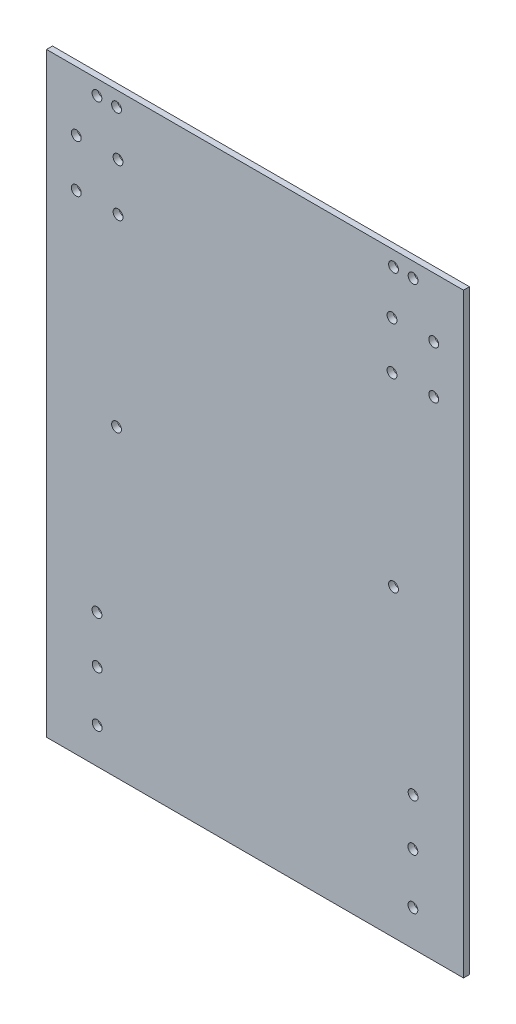
ISO-10303-21;
HEADER;
FILE_DESCRIPTION(('STEP AP214'),'2;1');
FILE_NAME('part.step','',(''),(''),'','','');
FILE_SCHEMA(('AUTOMOTIVE_DESIGN { 1 0 10303 214 1 1 1 1 }'));
ENDSEC;
DATA;
#1=APPLICATION_CONTEXT('core data for automotive mechanical design processes');
#2=APPLICATION_PROTOCOL_DEFINITION('international standard','automotive_design',2000,#1);
#3=PRODUCT_CONTEXT('',#1,'mechanical');
#4=PRODUCT('Part','Part','',(#3));
#5=PRODUCT_RELATED_PRODUCT_CATEGORY('part','',(#4));
#6=PRODUCT_DEFINITION_FORMATION('','',#4);
#7=PRODUCT_DEFINITION_CONTEXT('part definition',#1,'design');
#8=PRODUCT_DEFINITION('design','',#6,#7);
#9=PRODUCT_DEFINITION_SHAPE('','',#8);
#10=(LENGTH_UNIT() NAMED_UNIT(*) SI_UNIT(.MILLI.,.METRE.));
#11=(NAMED_UNIT(*) PLANE_ANGLE_UNIT() SI_UNIT($,.RADIAN.));
#12=(NAMED_UNIT(*) SI_UNIT($,.STERADIAN.) SOLID_ANGLE_UNIT());
#13=UNCERTAINTY_MEASURE_WITH_UNIT(LENGTH_MEASURE(1.E-05),#10,'distance_accuracy_value','');
#14=(GEOMETRIC_REPRESENTATION_CONTEXT(3) GLOBAL_UNCERTAINTY_ASSIGNED_CONTEXT((#13)) GLOBAL_UNIT_ASSIGNED_CONTEXT((#10,
#11,#12)) REPRESENTATION_CONTEXT('',''));
#15=CARTESIAN_POINT('',(0.,0.,0.));
#16=DIRECTION('',(0.,0.,1.));
#17=DIRECTION('',(1.,0.,0.));
#18=AXIS2_PLACEMENT_3D('',#15,#16,#17);
#19=CARTESIAN_POINT('',(-34.1846700507614,39.4891878172589,2.));
#20=DIRECTION('',(1.,0.,0.));
#21=DIRECTION('',(0.,1.,0.));
#22=AXIS2_PLACEMENT_3D('',#19,#20,#21);
#23=PLANE('',#22);
#24=DIRECTION('',(0.,-1.,0.));
#25=VECTOR('',#24,1.);
#26=CARTESIAN_POINT('',(-34.1846700507614,39.4891878172589,0.));
#27=LINE('',#26,#25);
#28=CARTESIAN_POINT('',(-34.1846700507614,39.4891878172589,0.));
#29=VERTEX_POINT('',#28);
#30=CARTESIAN_POINT('',(-34.1846700507614,-160.510812182741,0.));
#31=VERTEX_POINT('',#30);
#32=EDGE_CURVE('E102',#29,#31,#27,.T.);
#33=ORIENTED_EDGE('',*,*,#32,.T.);
#34=DIRECTION('',(0.,0.,-1.));
#35=VECTOR('',#34,1.);
#36=CARTESIAN_POINT('',(-34.1846700507614,-160.510812182741,2.));
#37=LINE('',#36,#35);
#38=CARTESIAN_POINT('',(-34.1846700507614,-160.510812182741,2.));
#39=VERTEX_POINT('',#38);
#40=EDGE_CURVE('E11',#39,#31,#37,.T.);
#41=ORIENTED_EDGE('',*,*,#40,.F.);
#42=DIRECTION('',(0.,-1.,0.));
#43=VECTOR('',#42,1.);
#44=CARTESIAN_POINT('',(-34.1846700507614,39.4891878172589,2.));
#45=LINE('',#44,#43);
#46=CARTESIAN_POINT('',(-34.1846700507614,39.4891878172589,2.));
#47=VERTEX_POINT('',#46);
#48=EDGE_CURVE('E89',#47,#39,#45,.T.);
#49=ORIENTED_EDGE('',*,*,#48,.F.);
#50=DIRECTION('',(0.,0.,-1.));
#51=VECTOR('',#50,1.);
#52=CARTESIAN_POINT('',(-34.1846700507614,39.4891878172589,2.));
#53=LINE('',#52,#51);
#54=EDGE_CURVE('E98',#47,#29,#53,.T.);
#55=ORIENTED_EDGE('',*,*,#54,.T.);
#56=EDGE_LOOP('',(#33,#41,#49,#55));
#57=FACE_BOUND('',#56,.T.);
#58=ADVANCED_FACE('F36',(#57),#23,.F.);
#59=CARTESIAN_POINT('',(-34.1846700507614,-160.510812182741,2.));
#60=DIRECTION('',(0.,1.,0.));
#61=DIRECTION('',(0.,0.,1.));
#62=AXIS2_PLACEMENT_3D('',#59,#60,#61);
#63=PLANE('',#62);
#64=DIRECTION('',(1.,0.,0.));
#65=VECTOR('',#64,1.);
#66=CARTESIAN_POINT('',(-34.1846700507614,-160.510812182741,0.));
#67=LINE('',#66,#65);
#68=CARTESIAN_POINT('',(105.815329949239,-160.510812182741,0.));
#69=VERTEX_POINT('',#68);
#70=EDGE_CURVE('E93',#31,#69,#67,.T.);
#71=ORIENTED_EDGE('',*,*,#70,.T.);
#72=DIRECTION('',(0.,0.,-1.));
#73=VECTOR('',#72,1.);
#74=CARTESIAN_POINT('',(105.815329949239,-160.510812182741,2.));
#75=LINE('',#74,#73);
#76=CARTESIAN_POINT('',(105.815329949239,-160.510812182741,2.));
#77=VERTEX_POINT('',#76);
#78=EDGE_CURVE('E45',#77,#69,#75,.T.);
#79=ORIENTED_EDGE('',*,*,#78,.F.);
#80=DIRECTION('',(1.,0.,0.));
#81=VECTOR('',#80,1.);
#82=CARTESIAN_POINT('',(-34.1846700507614,-160.510812182741,2.));
#83=LINE('',#82,#81);
#84=EDGE_CURVE('E84',#39,#77,#83,.T.);
#85=ORIENTED_EDGE('',*,*,#84,.F.);
#86=ORIENTED_EDGE('',*,*,#40,.T.);
#87=EDGE_LOOP('',(#71,#79,#85,#86));
#88=FACE_BOUND('',#87,.T.);
#89=ADVANCED_FACE('F92',(#88),#63,.F.);
#90=CARTESIAN_POINT('',(105.815329949239,39.4891878172589,2.));
#91=DIRECTION('',(-1.,0.,0.));
#92=DIRECTION('',(0.,-1.,0.));
#93=AXIS2_PLACEMENT_3D('',#90,#91,#92);
#94=PLANE('',#93);
#95=DIRECTION('',(0.,1.,0.));
#96=VECTOR('',#95,1.);
#97=CARTESIAN_POINT('',(105.815329949239,39.4891878172589,0.));
#98=LINE('',#97,#96);
#99=CARTESIAN_POINT('',(105.815329949239,39.4891878172589,0.));
#100=VERTEX_POINT('',#99);
#101=EDGE_CURVE('E71',#69,#100,#98,.T.);
#102=ORIENTED_EDGE('',*,*,#101,.T.);
#103=DIRECTION('',(0.,0.,-1.));
#104=VECTOR('',#103,1.);
#105=CARTESIAN_POINT('',(105.815329949239,39.4891878172589,2.));
#106=LINE('',#105,#104);
#107=CARTESIAN_POINT('',(105.815329949239,39.4891878172589,2.));
#108=VERTEX_POINT('',#107);
#109=EDGE_CURVE('E94',#108,#100,#106,.T.);
#110=ORIENTED_EDGE('',*,*,#109,.F.);
#111=DIRECTION('',(0.,1.,0.));
#112=VECTOR('',#111,1.);
#113=CARTESIAN_POINT('',(105.815329949239,39.4891878172589,2.));
#114=LINE('',#113,#112);
#115=EDGE_CURVE('E87',#77,#108,#114,.T.);
#116=ORIENTED_EDGE('',*,*,#115,.F.);
#117=ORIENTED_EDGE('',*,*,#78,.T.);
#118=EDGE_LOOP('',(#102,#110,#116,#117));
#119=FACE_BOUND('',#118,.T.);
#120=ADVANCED_FACE('F96',(#119),#94,.F.);
#121=CARTESIAN_POINT('',(-34.1846700507614,39.4891878172589,2.));
#122=DIRECTION('',(0.,-1.,0.));
#123=DIRECTION('',(0.,0.,-1.));
#124=AXIS2_PLACEMENT_3D('',#121,#122,#123);
#125=PLANE('',#124);
#126=DIRECTION('',(-1.,0.,0.));
#127=VECTOR('',#126,1.);
#128=CARTESIAN_POINT('',(-34.1846700507614,39.4891878172589,0.));
#129=LINE('',#128,#127);
#130=EDGE_CURVE('E77',#100,#29,#129,.T.);
#131=ORIENTED_EDGE('',*,*,#130,.T.);
#132=ORIENTED_EDGE('',*,*,#54,.F.);
#133=DIRECTION('',(-1.,0.,0.));
#134=VECTOR('',#133,1.);
#135=CARTESIAN_POINT('',(-34.1846700507614,39.4891878172589,2.));
#136=LINE('',#135,#134);
#137=EDGE_CURVE('E54',#108,#47,#136,.T.);
#138=ORIENTED_EDGE('',*,*,#137,.F.);
#139=ORIENTED_EDGE('',*,*,#109,.T.);
#140=EDGE_LOOP('',(#131,#132,#138,#139));
#141=FACE_BOUND('',#140,.T.);
#142=ADVANCED_FACE('F236',(#141),#125,.F.);
#143=CARTESIAN_POINT('',(0.,0.,2.));
#144=DIRECTION('',(0.,0.,1.));
#145=DIRECTION('',(1.,0.,0.));
#146=AXIS2_PLACEMENT_3D('',#143,#144,#145);
#147=PLANE('',#146);
#148=CARTESIAN_POINT('',(-17.2546700507614,-115.720812182741,2.));
#149=DIRECTION('',(0.,0.,1.));
#150=DIRECTION('',(-1.,0.,0.));
#151=AXIS2_PLACEMENT_3D('',#148,#149,#150);
#152=CIRCLE('',#151,1.65);
#153=CARTESIAN_POINT('',(-18.9046700507614,-115.720812182741,2.));
#154=VERTEX_POINT('',#153);
#155=EDGE_CURVE('E193',#154,#154,#152,.T.);
#156=ORIENTED_EDGE('',*,*,#155,.F.);
#157=EDGE_LOOP('',(#156));
#158=FACE_BOUND('',#157,.T.);
#159=CARTESIAN_POINT('',(88.8853299492386,-115.720812182741,2.));
#160=DIRECTION('',(0.,0.,1.));
#161=DIRECTION('',(1.,0.,0.));
#162=AXIS2_PLACEMENT_3D('',#159,#160,#161);
#163=CIRCLE('',#162,1.65);
#164=CARTESIAN_POINT('',(90.5353299492386,-115.720812182741,2.));
#165=VERTEX_POINT('',#164);
#166=EDGE_CURVE('E183',#165,#165,#163,.T.);
#167=ORIENTED_EDGE('',*,*,#166,.F.);
#168=EDGE_LOOP('',(#167));
#169=FACE_BOUND('',#168,.T.);
#170=CARTESIAN_POINT('',(88.8853299492386,34.4891878172589,2.));
#171=DIRECTION('',(0.,0.,1.));
#172=DIRECTION('',(-1.,0.,0.));
#173=AXIS2_PLACEMENT_3D('',#170,#171,#172);
#174=CIRCLE('',#173,1.65);
#175=CARTESIAN_POINT('',(87.2353299492386,34.4891878172589,2.));
#176=VERTEX_POINT('',#175);
#177=EDGE_CURVE('E180',#176,#176,#174,.T.);
#178=ORIENTED_EDGE('',*,*,#177,.F.);
#179=EDGE_LOOP('',(#178));
#180=FACE_BOUND('',#179,.T.);
#181=CARTESIAN_POINT('',(-17.2546700507614,34.4891878172589,2.));
#182=DIRECTION('',(0.,0.,1.));
#183=DIRECTION('',(1.,0.,0.));
#184=AXIS2_PLACEMENT_3D('',#181,#182,#183);
#185=CIRCLE('',#184,1.65);
#186=CARTESIAN_POINT('',(-15.6046700507614,34.4891878172589,2.));
#187=VERTEX_POINT('',#186);
#188=EDGE_CURVE('E177',#187,#187,#185,.T.);
#189=ORIENTED_EDGE('',*,*,#188,.F.);
#190=EDGE_LOOP('',(#189));
#191=FACE_BOUND('',#190,.T.);
#192=CARTESIAN_POINT('',(88.8153299492386,-131.510812182741,2.));
#193=DIRECTION('',(0.,0.,1.));
#194=DIRECTION('',(-1.,0.,0.));
#195=AXIS2_PLACEMENT_3D('',#192,#193,#194);
#196=CIRCLE('',#195,1.65000000000001);
#197=CARTESIAN_POINT('',(87.1653299492386,-131.510812182741,2.));
#198=VERTEX_POINT('',#197);
#199=EDGE_CURVE('E173',#198,#198,#196,.T.);
#200=ORIENTED_EDGE('',*,*,#199,.F.);
#201=EDGE_LOOP('',(#200));
#202=FACE_BOUND('',#201,.T.);
#203=CARTESIAN_POINT('',(88.8153299492386,-148.510812182741,2.));
#204=DIRECTION('',(0.,0.,1.));
#205=DIRECTION('',(-1.,0.,0.));
#206=AXIS2_PLACEMENT_3D('',#203,#204,#205);
#207=CIRCLE('',#206,1.65000000000001);
#208=CARTESIAN_POINT('',(87.1653299492386,-148.510812182741,2.));
#209=VERTEX_POINT('',#208);
#210=EDGE_CURVE('E169',#209,#209,#207,.T.);
#211=ORIENTED_EDGE('',*,*,#210,.F.);
#212=EDGE_LOOP('',(#211));
#213=FACE_BOUND('',#212,.T.);
#214=CARTESIAN_POINT('',(-17.1846700507614,-148.510812182741,2.));
#215=DIRECTION('',(0.,0.,1.));
#216=DIRECTION('',(1.,0.,0.));
#217=AXIS2_PLACEMENT_3D('',#214,#215,#216);
#218=CIRCLE('',#217,1.65000000000001);
#219=CARTESIAN_POINT('',(-15.5346700507614,-148.510812182741,2.));
#220=VERTEX_POINT('',#219);
#221=EDGE_CURVE('E165',#220,#220,#218,.T.);
#222=ORIENTED_EDGE('',*,*,#221,.F.);
#223=EDGE_LOOP('',(#222));
#224=FACE_BOUND('',#223,.T.);
#225=CARTESIAN_POINT('',(-17.1846700507614,-131.510812182741,2.));
#226=DIRECTION('',(0.,0.,1.));
#227=DIRECTION('',(1.,0.,0.));
#228=AXIS2_PLACEMENT_3D('',#225,#226,#227);
#229=CIRCLE('',#228,1.65);
#230=CARTESIAN_POINT('',(-15.5346700507614,-131.510812182741,2.));
#231=VERTEX_POINT('',#230);
#232=EDGE_CURVE('E161',#231,#231,#229,.T.);
#233=ORIENTED_EDGE('',*,*,#232,.F.);
#234=EDGE_LOOP('',(#233));
#235=FACE_BOUND('',#234,.T.);
#236=CARTESIAN_POINT('',(95.8153299492386,19.4891878172589,2.));
#237=DIRECTION('',(0.,0.,1.));
#238=DIRECTION('',(-1.,0.,0.));
#239=AXIS2_PLACEMENT_3D('',#236,#237,#238);
#240=CIRCLE('',#239,1.64999999999999);
#241=CARTESIAN_POINT('',(94.1653299492386,19.4891878172589,2.));
#242=VERTEX_POINT('',#241);
#243=EDGE_CURVE('E157',#242,#242,#240,.T.);
#244=ORIENTED_EDGE('',*,*,#243,.F.);
#245=EDGE_LOOP('',(#244));
#246=FACE_BOUND('',#245,.T.);
#247=CARTESIAN_POINT('',(81.8153299492386,19.4891878172589,2.));
#248=DIRECTION('',(0.,0.,1.));
#249=DIRECTION('',(-1.,0.,0.));
#250=AXIS2_PLACEMENT_3D('',#247,#248,#249);
#251=CIRCLE('',#250,1.65);
#252=CARTESIAN_POINT('',(80.1653299492386,19.4891878172589,2.));
#253=VERTEX_POINT('',#252);
#254=EDGE_CURVE('E153',#253,#253,#251,.T.);
#255=ORIENTED_EDGE('',*,*,#254,.F.);
#256=EDGE_LOOP('',(#255));
#257=FACE_BOUND('',#256,.T.);
#258=CARTESIAN_POINT('',(95.8153299492386,3.48918781725891,2.));
#259=DIRECTION('',(0.,0.,1.));
#260=DIRECTION('',(-1.,0.,0.));
#261=AXIS2_PLACEMENT_3D('',#258,#259,#260);
#262=CIRCLE('',#261,1.64999999999999);
#263=CARTESIAN_POINT('',(94.1653299492386,3.48918781725891,2.));
#264=VERTEX_POINT('',#263);
#265=EDGE_CURVE('E149',#264,#264,#262,.T.);
#266=ORIENTED_EDGE('',*,*,#265,.F.);
#267=EDGE_LOOP('',(#266));
#268=FACE_BOUND('',#267,.T.);
#269=CARTESIAN_POINT('',(81.8153299492386,3.48918781725891,2.));
#270=DIRECTION('',(0.,0.,1.));
#271=DIRECTION('',(-1.,0.,0.));
#272=AXIS2_PLACEMENT_3D('',#269,#270,#271);
#273=CIRCLE('',#272,1.65000000000002);
#274=CARTESIAN_POINT('',(80.1653299492386,3.48918781725891,2.));
#275=VERTEX_POINT('',#274);
#276=EDGE_CURVE('E145',#275,#275,#273,.T.);
#277=ORIENTED_EDGE('',*,*,#276,.F.);
#278=EDGE_LOOP('',(#277));
#279=FACE_BOUND('',#278,.T.);
#280=CARTESIAN_POINT('',(-10.1846700507614,3.4891878172589,2.));
#281=DIRECTION('',(0.,0.,1.));
#282=DIRECTION('',(1.,0.,0.));
#283=AXIS2_PLACEMENT_3D('',#280,#281,#282);
#284=CIRCLE('',#283,1.65);
#285=CARTESIAN_POINT('',(-8.53467005076142,3.4891878172589,2.));
#286=VERTEX_POINT('',#285);
#287=EDGE_CURVE('E141',#286,#286,#284,.T.);
#288=ORIENTED_EDGE('',*,*,#287,.F.);
#289=EDGE_LOOP('',(#288));
#290=FACE_BOUND('',#289,.T.);
#291=CARTESIAN_POINT('',(-24.1846700507614,3.48918781725889,2.));
#292=DIRECTION('',(0.,0.,1.));
#293=DIRECTION('',(1.,0.,0.));
#294=AXIS2_PLACEMENT_3D('',#291,#292,#293);
#295=CIRCLE('',#294,1.65);
#296=CARTESIAN_POINT('',(-22.5346700507614,3.48918781725889,2.));
#297=VERTEX_POINT('',#296);
#298=EDGE_CURVE('E137',#297,#297,#295,.T.);
#299=ORIENTED_EDGE('',*,*,#298,.F.);
#300=EDGE_LOOP('',(#299));
#301=FACE_BOUND('',#300,.T.);
#302=CARTESIAN_POINT('',(-10.1846700507614,19.4891878172589,2.));
#303=DIRECTION('',(0.,0.,1.));
#304=DIRECTION('',(1.,0.,0.));
#305=AXIS2_PLACEMENT_3D('',#302,#303,#304);
#306=CIRCLE('',#305,1.65);
#307=CARTESIAN_POINT('',(-8.53467005076141,19.4891878172589,2.));
#308=VERTEX_POINT('',#307);
#309=EDGE_CURVE('E133',#308,#308,#306,.T.);
#310=ORIENTED_EDGE('',*,*,#309,.F.);
#311=EDGE_LOOP('',(#310));
#312=FACE_BOUND('',#311,.T.);
#313=CARTESIAN_POINT('',(-24.1846700507614,19.4891878172589,2.));
#314=DIRECTION('',(0.,0.,1.));
#315=DIRECTION('',(1.,0.,0.));
#316=AXIS2_PLACEMENT_3D('',#313,#314,#315);
#317=CIRCLE('',#316,1.65);
#318=CARTESIAN_POINT('',(-22.5346700507614,19.4891878172589,2.));
#319=VERTEX_POINT('',#318);
#320=EDGE_CURVE('E129',#319,#319,#317,.T.);
#321=ORIENTED_EDGE('',*,*,#320,.F.);
#322=EDGE_LOOP('',(#321));
#323=FACE_BOUND('',#322,.T.);
#324=CARTESIAN_POINT('',(-10.6846700507614,-58.5108121827411,2.));
#325=DIRECTION('',(0.,0.,1.));
#326=DIRECTION('',(-1.,0.,0.));
#327=AXIS2_PLACEMENT_3D('',#324,#325,#326);
#328=CIRCLE('',#327,1.65);
#329=CARTESIAN_POINT('',(-12.3346700507614,-58.5108121827411,2.));
#330=VERTEX_POINT('',#329);
#331=EDGE_CURVE('E125',#330,#330,#328,.T.);
#332=ORIENTED_EDGE('',*,*,#331,.F.);
#333=EDGE_LOOP('',(#332));
#334=FACE_BOUND('',#333,.T.);
#335=CARTESIAN_POINT('',(82.3153299492386,-58.5108121827411,2.));
#336=DIRECTION('',(0.,0.,1.));
#337=DIRECTION('',(1.,0.,0.));
#338=AXIS2_PLACEMENT_3D('',#335,#336,#337);
#339=CIRCLE('',#338,1.65);
#340=CARTESIAN_POINT('',(83.9653299492386,-58.5108121827411,2.));
#341=VERTEX_POINT('',#340);
#342=EDGE_CURVE('E121',#341,#341,#339,.T.);
#343=ORIENTED_EDGE('',*,*,#342,.F.);
#344=EDGE_LOOP('',(#343));
#345=FACE_BOUND('',#344,.T.);
#346=CARTESIAN_POINT('',(82.3153299492386,34.4891878172589,2.));
#347=DIRECTION('',(0.,0.,1.));
#348=DIRECTION('',(-1.,0.,0.));
#349=AXIS2_PLACEMENT_3D('',#346,#347,#348);
#350=CIRCLE('',#349,1.65);
#351=CARTESIAN_POINT('',(80.6653299492386,34.4891878172589,2.));
#352=VERTEX_POINT('',#351);
#353=EDGE_CURVE('E117',#352,#352,#350,.T.);
#354=ORIENTED_EDGE('',*,*,#353,.F.);
#355=EDGE_LOOP('',(#354));
#356=FACE_BOUND('',#355,.T.);
#357=CARTESIAN_POINT('',(-10.6846700507614,34.4891878172589,2.));
#358=DIRECTION('',(0.,0.,1.));
#359=DIRECTION('',(1.,0.,0.));
#360=AXIS2_PLACEMENT_3D('',#357,#358,#359);
#361=CIRCLE('',#360,1.65);
#362=CARTESIAN_POINT('',(-9.03467005076142,34.4891878172589,2.));
#363=VERTEX_POINT('',#362);
#364=EDGE_CURVE('E113',#363,#363,#361,.T.);
#365=ORIENTED_EDGE('',*,*,#364,.F.);
#366=EDGE_LOOP('',(#365));
#367=FACE_BOUND('',#366,.T.);
#368=ORIENTED_EDGE('',*,*,#48,.T.);
#369=ORIENTED_EDGE('',*,*,#84,.T.);
#370=ORIENTED_EDGE('',*,*,#115,.T.);
#371=ORIENTED_EDGE('',*,*,#137,.T.);
#372=EDGE_LOOP('',(#368,#369,#370,#371));
#373=FACE_BOUND('',#372,.T.);
#374=ADVANCED_FACE('F85',(#158,#169,#180,#191,#202,#213,#224,#235,#246,#257,#268,#279,#290,#301,
#312,#323,#334,#345,#356,#367,#373),#147,.T.);
#375=CARTESIAN_POINT('',(0.,0.,0.));
#376=DIRECTION('',(0.,0.,1.));
#377=DIRECTION('',(1.,0.,0.));
#378=AXIS2_PLACEMENT_3D('',#375,#376,#377);
#379=PLANE('',#378);
#380=CARTESIAN_POINT('',(-17.2546700507614,-115.720812182741,0.));
#381=DIRECTION('',(0.,0.,1.));
#382=DIRECTION('',(1.,0.,0.));
#383=AXIS2_PLACEMENT_3D('',#380,#381,#382);
#384=CIRCLE('',#383,1.65);
#385=CARTESIAN_POINT('',(-15.6046700507614,-115.720812182741,0.));
#386=VERTEX_POINT('',#385);
#387=EDGE_CURVE('E39',#386,#386,#384,.T.);
#388=ORIENTED_EDGE('',*,*,#387,.T.);
#389=EDGE_LOOP('',(#388));
#390=FACE_BOUND('',#389,.T.);
#391=CARTESIAN_POINT('',(88.8853299492386,-115.720812182741,0.));
#392=DIRECTION('',(0.,0.,1.));
#393=DIRECTION('',(1.,0.,0.));
#394=AXIS2_PLACEMENT_3D('',#391,#392,#393);
#395=CIRCLE('',#394,1.65);
#396=CARTESIAN_POINT('',(90.5353299492386,-115.720812182741,0.));
#397=VERTEX_POINT('',#396);
#398=EDGE_CURVE('E181',#397,#397,#395,.T.);
#399=ORIENTED_EDGE('',*,*,#398,.T.);
#400=EDGE_LOOP('',(#399));
#401=FACE_BOUND('',#400,.T.);
#402=CARTESIAN_POINT('',(88.8853299492386,34.4891878172589,0.));
#403=DIRECTION('',(0.,0.,1.));
#404=DIRECTION('',(1.,0.,0.));
#405=AXIS2_PLACEMENT_3D('',#402,#403,#404);
#406=CIRCLE('',#405,1.65);
#407=CARTESIAN_POINT('',(90.5353299492386,34.4891878172589,0.));
#408=VERTEX_POINT('',#407);
#409=EDGE_CURVE('E178',#408,#408,#406,.T.);
#410=ORIENTED_EDGE('',*,*,#409,.T.);
#411=EDGE_LOOP('',(#410));
#412=FACE_BOUND('',#411,.T.);
#413=CARTESIAN_POINT('',(-17.2546700507614,34.4891878172589,0.));
#414=DIRECTION('',(0.,0.,1.));
#415=DIRECTION('',(1.,0.,0.));
#416=AXIS2_PLACEMENT_3D('',#413,#414,#415);
#417=CIRCLE('',#416,1.65);
#418=CARTESIAN_POINT('',(-15.6046700507614,34.4891878172589,0.));
#419=VERTEX_POINT('',#418);
#420=EDGE_CURVE('E174',#419,#419,#417,.T.);
#421=ORIENTED_EDGE('',*,*,#420,.T.);
#422=EDGE_LOOP('',(#421));
#423=FACE_BOUND('',#422,.T.);
#424=CARTESIAN_POINT('',(88.8153299492386,-131.510812182741,0.));
#425=DIRECTION('',(0.,0.,1.));
#426=DIRECTION('',(1.,0.,0.));
#427=AXIS2_PLACEMENT_3D('',#424,#425,#426);
#428=CIRCLE('',#427,1.65000000000001);
#429=CARTESIAN_POINT('',(90.4653299492386,-131.510812182741,0.));
#430=VERTEX_POINT('',#429);
#431=EDGE_CURVE('E170',#430,#430,#428,.T.);
#432=ORIENTED_EDGE('',*,*,#431,.T.);
#433=EDGE_LOOP('',(#432));
#434=FACE_BOUND('',#433,.T.);
#435=CARTESIAN_POINT('',(88.8153299492386,-148.510812182741,0.));
#436=DIRECTION('',(0.,0.,1.));
#437=DIRECTION('',(1.,0.,0.));
#438=AXIS2_PLACEMENT_3D('',#435,#436,#437);
#439=CIRCLE('',#438,1.65000000000001);
#440=CARTESIAN_POINT('',(90.4653299492386,-148.510812182741,0.));
#441=VERTEX_POINT('',#440);
#442=EDGE_CURVE('E166',#441,#441,#439,.T.);
#443=ORIENTED_EDGE('',*,*,#442,.T.);
#444=EDGE_LOOP('',(#443));
#445=FACE_BOUND('',#444,.T.);
#446=CARTESIAN_POINT('',(-17.1846700507614,-148.510812182741,0.));
#447=DIRECTION('',(0.,0.,1.));
#448=DIRECTION('',(1.,0.,0.));
#449=AXIS2_PLACEMENT_3D('',#446,#447,#448);
#450=CIRCLE('',#449,1.65000000000001);
#451=CARTESIAN_POINT('',(-15.5346700507614,-148.510812182741,0.));
#452=VERTEX_POINT('',#451);
#453=EDGE_CURVE('E162',#452,#452,#450,.T.);
#454=ORIENTED_EDGE('',*,*,#453,.T.);
#455=EDGE_LOOP('',(#454));
#456=FACE_BOUND('',#455,.T.);
#457=CARTESIAN_POINT('',(-17.1846700507614,-131.510812182741,0.));
#458=DIRECTION('',(0.,0.,1.));
#459=DIRECTION('',(1.,0.,0.));
#460=AXIS2_PLACEMENT_3D('',#457,#458,#459);
#461=CIRCLE('',#460,1.65);
#462=CARTESIAN_POINT('',(-15.5346700507614,-131.510812182741,0.));
#463=VERTEX_POINT('',#462);
#464=EDGE_CURVE('E158',#463,#463,#461,.T.);
#465=ORIENTED_EDGE('',*,*,#464,.T.);
#466=EDGE_LOOP('',(#465));
#467=FACE_BOUND('',#466,.T.);
#468=CARTESIAN_POINT('',(95.8153299492386,19.4891878172589,0.));
#469=DIRECTION('',(0.,0.,1.));
#470=DIRECTION('',(1.,0.,0.));
#471=AXIS2_PLACEMENT_3D('',#468,#469,#470);
#472=CIRCLE('',#471,1.64999999999999);
#473=CARTESIAN_POINT('',(97.4653299492386,19.4891878172589,0.));
#474=VERTEX_POINT('',#473);
#475=EDGE_CURVE('E154',#474,#474,#472,.T.);
#476=ORIENTED_EDGE('',*,*,#475,.T.);
#477=EDGE_LOOP('',(#476));
#478=FACE_BOUND('',#477,.T.);
#479=CARTESIAN_POINT('',(81.8153299492386,19.4891878172589,0.));
#480=DIRECTION('',(0.,0.,1.));
#481=DIRECTION('',(1.,0.,0.));
#482=AXIS2_PLACEMENT_3D('',#479,#480,#481);
#483=CIRCLE('',#482,1.65);
#484=CARTESIAN_POINT('',(83.4653299492386,19.4891878172589,0.));
#485=VERTEX_POINT('',#484);
#486=EDGE_CURVE('E150',#485,#485,#483,.T.);
#487=ORIENTED_EDGE('',*,*,#486,.T.);
#488=EDGE_LOOP('',(#487));
#489=FACE_BOUND('',#488,.T.);
#490=CARTESIAN_POINT('',(95.8153299492386,3.48918781725891,0.));
#491=DIRECTION('',(0.,0.,1.));
#492=DIRECTION('',(1.,0.,0.));
#493=AXIS2_PLACEMENT_3D('',#490,#491,#492);
#494=CIRCLE('',#493,1.64999999999999);
#495=CARTESIAN_POINT('',(97.4653299492386,3.48918781725891,0.));
#496=VERTEX_POINT('',#495);
#497=EDGE_CURVE('E146',#496,#496,#494,.T.);
#498=ORIENTED_EDGE('',*,*,#497,.T.);
#499=EDGE_LOOP('',(#498));
#500=FACE_BOUND('',#499,.T.);
#501=CARTESIAN_POINT('',(81.8153299492386,3.48918781725891,0.));
#502=DIRECTION('',(0.,0.,1.));
#503=DIRECTION('',(1.,0.,0.));
#504=AXIS2_PLACEMENT_3D('',#501,#502,#503);
#505=CIRCLE('',#504,1.65000000000002);
#506=CARTESIAN_POINT('',(83.4653299492386,3.48918781725891,0.));
#507=VERTEX_POINT('',#506);
#508=EDGE_CURVE('E142',#507,#507,#505,.T.);
#509=ORIENTED_EDGE('',*,*,#508,.T.);
#510=EDGE_LOOP('',(#509));
#511=FACE_BOUND('',#510,.T.);
#512=CARTESIAN_POINT('',(-10.1846700507614,3.4891878172589,0.));
#513=DIRECTION('',(0.,0.,1.));
#514=DIRECTION('',(1.,0.,0.));
#515=AXIS2_PLACEMENT_3D('',#512,#513,#514);
#516=CIRCLE('',#515,1.65);
#517=CARTESIAN_POINT('',(-8.53467005076142,3.4891878172589,0.));
#518=VERTEX_POINT('',#517);
#519=EDGE_CURVE('E138',#518,#518,#516,.T.);
#520=ORIENTED_EDGE('',*,*,#519,.T.);
#521=EDGE_LOOP('',(#520));
#522=FACE_BOUND('',#521,.T.);
#523=CARTESIAN_POINT('',(-24.1846700507614,3.48918781725889,0.));
#524=DIRECTION('',(0.,0.,1.));
#525=DIRECTION('',(1.,0.,0.));
#526=AXIS2_PLACEMENT_3D('',#523,#524,#525);
#527=CIRCLE('',#526,1.65);
#528=CARTESIAN_POINT('',(-22.5346700507614,3.48918781725889,0.));
#529=VERTEX_POINT('',#528);
#530=EDGE_CURVE('E134',#529,#529,#527,.T.);
#531=ORIENTED_EDGE('',*,*,#530,.T.);
#532=EDGE_LOOP('',(#531));
#533=FACE_BOUND('',#532,.T.);
#534=CARTESIAN_POINT('',(-10.1846700507614,19.4891878172589,0.));
#535=DIRECTION('',(0.,0.,1.));
#536=DIRECTION('',(1.,0.,0.));
#537=AXIS2_PLACEMENT_3D('',#534,#535,#536);
#538=CIRCLE('',#537,1.65);
#539=CARTESIAN_POINT('',(-8.53467005076141,19.4891878172589,0.));
#540=VERTEX_POINT('',#539);
#541=EDGE_CURVE('E130',#540,#540,#538,.T.);
#542=ORIENTED_EDGE('',*,*,#541,.T.);
#543=EDGE_LOOP('',(#542));
#544=FACE_BOUND('',#543,.T.);
#545=CARTESIAN_POINT('',(-24.1846700507614,19.4891878172589,0.));
#546=DIRECTION('',(0.,0.,1.));
#547=DIRECTION('',(1.,0.,0.));
#548=AXIS2_PLACEMENT_3D('',#545,#546,#547);
#549=CIRCLE('',#548,1.65);
#550=CARTESIAN_POINT('',(-22.5346700507614,19.4891878172589,0.));
#551=VERTEX_POINT('',#550);
#552=EDGE_CURVE('E126',#551,#551,#549,.T.);
#553=ORIENTED_EDGE('',*,*,#552,.T.);
#554=EDGE_LOOP('',(#553));
#555=FACE_BOUND('',#554,.T.);
#556=CARTESIAN_POINT('',(-10.6846700507614,-58.5108121827411,0.));
#557=DIRECTION('',(0.,0.,1.));
#558=DIRECTION('',(1.,0.,0.));
#559=AXIS2_PLACEMENT_3D('',#556,#557,#558);
#560=CIRCLE('',#559,1.65);
#561=CARTESIAN_POINT('',(-9.03467005076142,-58.5108121827411,0.));
#562=VERTEX_POINT('',#561);
#563=EDGE_CURVE('E122',#562,#562,#560,.T.);
#564=ORIENTED_EDGE('',*,*,#563,.T.);
#565=EDGE_LOOP('',(#564));
#566=FACE_BOUND('',#565,.T.);
#567=CARTESIAN_POINT('',(82.3153299492386,-58.5108121827411,0.));
#568=DIRECTION('',(0.,0.,1.));
#569=DIRECTION('',(1.,0.,0.));
#570=AXIS2_PLACEMENT_3D('',#567,#568,#569);
#571=CIRCLE('',#570,1.65);
#572=CARTESIAN_POINT('',(83.9653299492386,-58.5108121827411,0.));
#573=VERTEX_POINT('',#572);
#574=EDGE_CURVE('E118',#573,#573,#571,.T.);
#575=ORIENTED_EDGE('',*,*,#574,.T.);
#576=EDGE_LOOP('',(#575));
#577=FACE_BOUND('',#576,.T.);
#578=CARTESIAN_POINT('',(82.3153299492386,34.4891878172589,0.));
#579=DIRECTION('',(0.,0.,1.));
#580=DIRECTION('',(1.,0.,0.));
#581=AXIS2_PLACEMENT_3D('',#578,#579,#580);
#582=CIRCLE('',#581,1.65);
#583=CARTESIAN_POINT('',(83.9653299492386,34.4891878172589,0.));
#584=VERTEX_POINT('',#583);
#585=EDGE_CURVE('E114',#584,#584,#582,.T.);
#586=ORIENTED_EDGE('',*,*,#585,.T.);
#587=EDGE_LOOP('',(#586));
#588=FACE_BOUND('',#587,.T.);
#589=CARTESIAN_POINT('',(-10.6846700507614,34.4891878172589,0.));
#590=DIRECTION('',(0.,0.,1.));
#591=DIRECTION('',(1.,0.,0.));
#592=AXIS2_PLACEMENT_3D('',#589,#590,#591);
#593=CIRCLE('',#592,1.65);
#594=CARTESIAN_POINT('',(-9.03467005076142,34.4891878172589,0.));
#595=VERTEX_POINT('',#594);
#596=EDGE_CURVE('E105',#595,#595,#593,.T.);
#597=ORIENTED_EDGE('',*,*,#596,.T.);
#598=EDGE_LOOP('',(#597));
#599=FACE_BOUND('',#598,.T.);
#600=ORIENTED_EDGE('',*,*,#32,.F.);
#601=ORIENTED_EDGE('',*,*,#130,.F.);
#602=ORIENTED_EDGE('',*,*,#101,.F.);
#603=ORIENTED_EDGE('',*,*,#70,.F.);
#604=EDGE_LOOP('',(#600,#601,#602,#603));
#605=FACE_BOUND('',#604,.T.);
#606=ADVANCED_FACE('F235',(#390,#401,#412,#423,#434,#445,#456,#467,#478,#489,#500,#511,#522,
#533,#544,#555,#566,#577,#588,#599,#605),#379,.F.);
#607=CARTESIAN_POINT('',(-10.6846700507614,34.4891878172589,-3.));
#608=DIRECTION('',(0.,0.,1.));
#609=DIRECTION('',(1.,0.,0.));
#610=AXIS2_PLACEMENT_3D('',#607,#608,#609);
#611=CYLINDRICAL_SURFACE('',#610,1.65);
#612=ORIENTED_EDGE('',*,*,#364,.T.);
#613=EDGE_LOOP('',(#612));
#614=FACE_BOUND('',#613,.T.);
#615=ORIENTED_EDGE('',*,*,#596,.F.);
#616=EDGE_LOOP('',(#615));
#617=FACE_BOUND('',#616,.T.);
#618=ADVANCED_FACE('F231',(#614,#617),#611,.F.);
#619=CARTESIAN_POINT('',(82.3153299492386,34.4891878172589,-3.));
#620=DIRECTION('',(0.,0.,1.));
#621=DIRECTION('',(1.,0.,0.));
#622=AXIS2_PLACEMENT_3D('',#619,#620,#621);
#623=CYLINDRICAL_SURFACE('',#622,1.65);
#624=ORIENTED_EDGE('',*,*,#353,.T.);
#625=EDGE_LOOP('',(#624));
#626=FACE_BOUND('',#625,.T.);
#627=ORIENTED_EDGE('',*,*,#585,.F.);
#628=EDGE_LOOP('',(#627));
#629=FACE_BOUND('',#628,.T.);
#630=ADVANCED_FACE('F288',(#626,#629),#623,.F.);
#631=CARTESIAN_POINT('',(82.3153299492386,-58.5108121827411,-3.));
#632=DIRECTION('',(0.,0.,1.));
#633=DIRECTION('',(1.,0.,0.));
#634=AXIS2_PLACEMENT_3D('',#631,#632,#633);
#635=CYLINDRICAL_SURFACE('',#634,1.65);
#636=ORIENTED_EDGE('',*,*,#342,.T.);
#637=EDGE_LOOP('',(#636));
#638=FACE_BOUND('',#637,.T.);
#639=ORIENTED_EDGE('',*,*,#574,.F.);
#640=EDGE_LOOP('',(#639));
#641=FACE_BOUND('',#640,.T.);
#642=ADVANCED_FACE('F296',(#638,#641),#635,.F.);
#643=CARTESIAN_POINT('',(-10.6846700507614,-58.5108121827411,-3.));
#644=DIRECTION('',(0.,0.,1.));
#645=DIRECTION('',(1.,0.,0.));
#646=AXIS2_PLACEMENT_3D('',#643,#644,#645);
#647=CYLINDRICAL_SURFACE('',#646,1.65);
#648=ORIENTED_EDGE('',*,*,#331,.T.);
#649=EDGE_LOOP('',(#648));
#650=FACE_BOUND('',#649,.T.);
#651=ORIENTED_EDGE('',*,*,#563,.F.);
#652=EDGE_LOOP('',(#651));
#653=FACE_BOUND('',#652,.T.);
#654=ADVANCED_FACE('F306',(#650,#653),#647,.F.);
#655=CARTESIAN_POINT('',(-24.1846700507614,19.4891878172589,-3.));
#656=DIRECTION('',(0.,0.,1.));
#657=DIRECTION('',(1.,0.,0.));
#658=AXIS2_PLACEMENT_3D('',#655,#656,#657);
#659=CYLINDRICAL_SURFACE('',#658,1.65);
#660=ORIENTED_EDGE('',*,*,#320,.T.);
#661=EDGE_LOOP('',(#660));
#662=FACE_BOUND('',#661,.T.);
#663=ORIENTED_EDGE('',*,*,#552,.F.);
#664=EDGE_LOOP('',(#663));
#665=FACE_BOUND('',#664,.T.);
#666=ADVANCED_FACE('F316',(#662,#665),#659,.F.);
#667=CARTESIAN_POINT('',(-10.1846700507614,19.4891878172589,-3.));
#668=DIRECTION('',(0.,0.,1.));
#669=DIRECTION('',(1.,0.,0.));
#670=AXIS2_PLACEMENT_3D('',#667,#668,#669);
#671=CYLINDRICAL_SURFACE('',#670,1.65);
#672=ORIENTED_EDGE('',*,*,#309,.T.);
#673=EDGE_LOOP('',(#672));
#674=FACE_BOUND('',#673,.T.);
#675=ORIENTED_EDGE('',*,*,#541,.F.);
#676=EDGE_LOOP('',(#675));
#677=FACE_BOUND('',#676,.T.);
#678=ADVANCED_FACE('F326',(#674,#677),#671,.F.);
#679=CARTESIAN_POINT('',(-24.1846700507614,3.48918781725889,-3.));
#680=DIRECTION('',(0.,0.,1.));
#681=DIRECTION('',(1.,0.,0.));
#682=AXIS2_PLACEMENT_3D('',#679,#680,#681);
#683=CYLINDRICAL_SURFACE('',#682,1.65);
#684=ORIENTED_EDGE('',*,*,#298,.T.);
#685=EDGE_LOOP('',(#684));
#686=FACE_BOUND('',#685,.T.);
#687=ORIENTED_EDGE('',*,*,#530,.F.);
#688=EDGE_LOOP('',(#687));
#689=FACE_BOUND('',#688,.T.);
#690=ADVANCED_FACE('F336',(#686,#689),#683,.F.);
#691=CARTESIAN_POINT('',(-10.1846700507614,3.4891878172589,-3.));
#692=DIRECTION('',(0.,0.,1.));
#693=DIRECTION('',(1.,0.,0.));
#694=AXIS2_PLACEMENT_3D('',#691,#692,#693);
#695=CYLINDRICAL_SURFACE('',#694,1.65);
#696=ORIENTED_EDGE('',*,*,#287,.T.);
#697=EDGE_LOOP('',(#696));
#698=FACE_BOUND('',#697,.T.);
#699=ORIENTED_EDGE('',*,*,#519,.F.);
#700=EDGE_LOOP('',(#699));
#701=FACE_BOUND('',#700,.T.);
#702=ADVANCED_FACE('F346',(#698,#701),#695,.F.);
#703=CARTESIAN_POINT('',(81.8153299492386,3.48918781725891,-3.));
#704=DIRECTION('',(0.,0.,1.));
#705=DIRECTION('',(1.,0.,0.));
#706=AXIS2_PLACEMENT_3D('',#703,#704,#705);
#707=CYLINDRICAL_SURFACE('',#706,1.65000000000002);
#708=ORIENTED_EDGE('',*,*,#276,.T.);
#709=EDGE_LOOP('',(#708));
#710=FACE_BOUND('',#709,.T.);
#711=ORIENTED_EDGE('',*,*,#508,.F.);
#712=EDGE_LOOP('',(#711));
#713=FACE_BOUND('',#712,.T.);
#714=ADVANCED_FACE('F356',(#710,#713),#707,.F.);
#715=CARTESIAN_POINT('',(95.8153299492386,3.48918781725891,-3.));
#716=DIRECTION('',(0.,0.,1.));
#717=DIRECTION('',(1.,0.,0.));
#718=AXIS2_PLACEMENT_3D('',#715,#716,#717);
#719=CYLINDRICAL_SURFACE('',#718,1.64999999999999);
#720=ORIENTED_EDGE('',*,*,#265,.T.);
#721=EDGE_LOOP('',(#720));
#722=FACE_BOUND('',#721,.T.);
#723=ORIENTED_EDGE('',*,*,#497,.F.);
#724=EDGE_LOOP('',(#723));
#725=FACE_BOUND('',#724,.T.);
#726=ADVANCED_FACE('F366',(#722,#725),#719,.F.);
#727=CARTESIAN_POINT('',(81.8153299492386,19.4891878172589,-3.));
#728=DIRECTION('',(0.,0.,1.));
#729=DIRECTION('',(1.,0.,0.));
#730=AXIS2_PLACEMENT_3D('',#727,#728,#729);
#731=CYLINDRICAL_SURFACE('',#730,1.65);
#732=ORIENTED_EDGE('',*,*,#254,.T.);
#733=EDGE_LOOP('',(#732));
#734=FACE_BOUND('',#733,.T.);
#735=ORIENTED_EDGE('',*,*,#486,.F.);
#736=EDGE_LOOP('',(#735));
#737=FACE_BOUND('',#736,.T.);
#738=ADVANCED_FACE('F376',(#734,#737),#731,.F.);
#739=CARTESIAN_POINT('',(95.8153299492386,19.4891878172589,-3.));
#740=DIRECTION('',(0.,0.,1.));
#741=DIRECTION('',(1.,0.,0.));
#742=AXIS2_PLACEMENT_3D('',#739,#740,#741);
#743=CYLINDRICAL_SURFACE('',#742,1.64999999999999);
#744=ORIENTED_EDGE('',*,*,#243,.T.);
#745=EDGE_LOOP('',(#744));
#746=FACE_BOUND('',#745,.T.);
#747=ORIENTED_EDGE('',*,*,#475,.F.);
#748=EDGE_LOOP('',(#747));
#749=FACE_BOUND('',#748,.T.);
#750=ADVANCED_FACE('F386',(#746,#749),#743,.F.);
#751=CARTESIAN_POINT('',(-17.1846700507614,-131.510812182741,-3.));
#752=DIRECTION('',(0.,0.,1.));
#753=DIRECTION('',(1.,0.,0.));
#754=AXIS2_PLACEMENT_3D('',#751,#752,#753);
#755=CYLINDRICAL_SURFACE('',#754,1.65);
#756=ORIENTED_EDGE('',*,*,#232,.T.);
#757=EDGE_LOOP('',(#756));
#758=FACE_BOUND('',#757,.T.);
#759=ORIENTED_EDGE('',*,*,#464,.F.);
#760=EDGE_LOOP('',(#759));
#761=FACE_BOUND('',#760,.T.);
#762=ADVANCED_FACE('F396',(#758,#761),#755,.F.);
#763=CARTESIAN_POINT('',(-17.1846700507614,-148.510812182741,-3.));
#764=DIRECTION('',(0.,0.,1.));
#765=DIRECTION('',(1.,0.,0.));
#766=AXIS2_PLACEMENT_3D('',#763,#764,#765);
#767=CYLINDRICAL_SURFACE('',#766,1.65000000000001);
#768=ORIENTED_EDGE('',*,*,#221,.T.);
#769=EDGE_LOOP('',(#768));
#770=FACE_BOUND('',#769,.T.);
#771=ORIENTED_EDGE('',*,*,#453,.F.);
#772=EDGE_LOOP('',(#771));
#773=FACE_BOUND('',#772,.T.);
#774=ADVANCED_FACE('F406',(#770,#773),#767,.F.);
#775=CARTESIAN_POINT('',(88.8153299492386,-148.510812182741,-3.));
#776=DIRECTION('',(0.,0.,1.));
#777=DIRECTION('',(1.,0.,0.));
#778=AXIS2_PLACEMENT_3D('',#775,#776,#777);
#779=CYLINDRICAL_SURFACE('',#778,1.65000000000001);
#780=ORIENTED_EDGE('',*,*,#210,.T.);
#781=EDGE_LOOP('',(#780));
#782=FACE_BOUND('',#781,.T.);
#783=ORIENTED_EDGE('',*,*,#442,.F.);
#784=EDGE_LOOP('',(#783));
#785=FACE_BOUND('',#784,.T.);
#786=ADVANCED_FACE('F416',(#782,#785),#779,.F.);
#787=CARTESIAN_POINT('',(88.8153299492386,-131.510812182741,-3.));
#788=DIRECTION('',(0.,0.,1.));
#789=DIRECTION('',(1.,0.,0.));
#790=AXIS2_PLACEMENT_3D('',#787,#788,#789);
#791=CYLINDRICAL_SURFACE('',#790,1.65000000000001);
#792=ORIENTED_EDGE('',*,*,#199,.T.);
#793=EDGE_LOOP('',(#792));
#794=FACE_BOUND('',#793,.T.);
#795=ORIENTED_EDGE('',*,*,#431,.F.);
#796=EDGE_LOOP('',(#795));
#797=FACE_BOUND('',#796,.T.);
#798=ADVANCED_FACE('F426',(#794,#797),#791,.F.);
#799=CARTESIAN_POINT('',(-17.2546700507614,34.4891878172589,-3.));
#800=DIRECTION('',(0.,0.,1.));
#801=DIRECTION('',(1.,0.,0.));
#802=AXIS2_PLACEMENT_3D('',#799,#800,#801);
#803=CYLINDRICAL_SURFACE('',#802,1.65);
#804=ORIENTED_EDGE('',*,*,#188,.T.);
#805=EDGE_LOOP('',(#804));
#806=FACE_BOUND('',#805,.T.);
#807=ORIENTED_EDGE('',*,*,#420,.F.);
#808=EDGE_LOOP('',(#807));
#809=FACE_BOUND('',#808,.T.);
#810=ADVANCED_FACE('F436',(#806,#809),#803,.F.);
#811=CARTESIAN_POINT('',(88.8853299492386,34.4891878172589,-3.));
#812=DIRECTION('',(0.,0.,1.));
#813=DIRECTION('',(1.,0.,0.));
#814=AXIS2_PLACEMENT_3D('',#811,#812,#813);
#815=CYLINDRICAL_SURFACE('',#814,1.65);
#816=ORIENTED_EDGE('',*,*,#177,.T.);
#817=EDGE_LOOP('',(#816));
#818=FACE_BOUND('',#817,.T.);
#819=ORIENTED_EDGE('',*,*,#409,.F.);
#820=EDGE_LOOP('',(#819));
#821=FACE_BOUND('',#820,.T.);
#822=ADVANCED_FACE('F446',(#818,#821),#815,.F.);
#823=CARTESIAN_POINT('',(88.8853299492386,-115.720812182741,-3.));
#824=DIRECTION('',(0.,0.,1.));
#825=DIRECTION('',(1.,0.,0.));
#826=AXIS2_PLACEMENT_3D('',#823,#824,#825);
#827=CYLINDRICAL_SURFACE('',#826,1.65);
#828=ORIENTED_EDGE('',*,*,#166,.T.);
#829=EDGE_LOOP('',(#828));
#830=FACE_BOUND('',#829,.T.);
#831=ORIENTED_EDGE('',*,*,#398,.F.);
#832=EDGE_LOOP('',(#831));
#833=FACE_BOUND('',#832,.T.);
#834=ADVANCED_FACE('F456',(#830,#833),#827,.F.);
#835=CARTESIAN_POINT('',(-17.2546700507614,-115.720812182741,-3.));
#836=DIRECTION('',(0.,0.,1.));
#837=DIRECTION('',(1.,0.,0.));
#838=AXIS2_PLACEMENT_3D('',#835,#836,#837);
#839=CYLINDRICAL_SURFACE('',#838,1.65);
#840=ORIENTED_EDGE('',*,*,#155,.T.);
#841=EDGE_LOOP('',(#840));
#842=FACE_BOUND('',#841,.T.);
#843=ORIENTED_EDGE('',*,*,#387,.F.);
#844=EDGE_LOOP('',(#843));
#845=FACE_BOUND('',#844,.T.);
#846=ADVANCED_FACE('F466',(#842,#845),#839,.F.);
#847=CLOSED_SHELL('',(#58,#89,#120,#142,#374,#606,#618,#630,#642,#654,#666,#678,#690,#702,#714,
#726,#738,#750,#762,#774,#786,#798,#810,#822,#834,#846));
#848=MANIFOLD_SOLID_BREP('B2',#847);
#849=ADVANCED_BREP_SHAPE_REPRESENTATION('',(#18,#848),#14);
#850=SHAPE_DEFINITION_REPRESENTATION(#9,#849);
ENDSEC;
END-ISO-10303-21;
